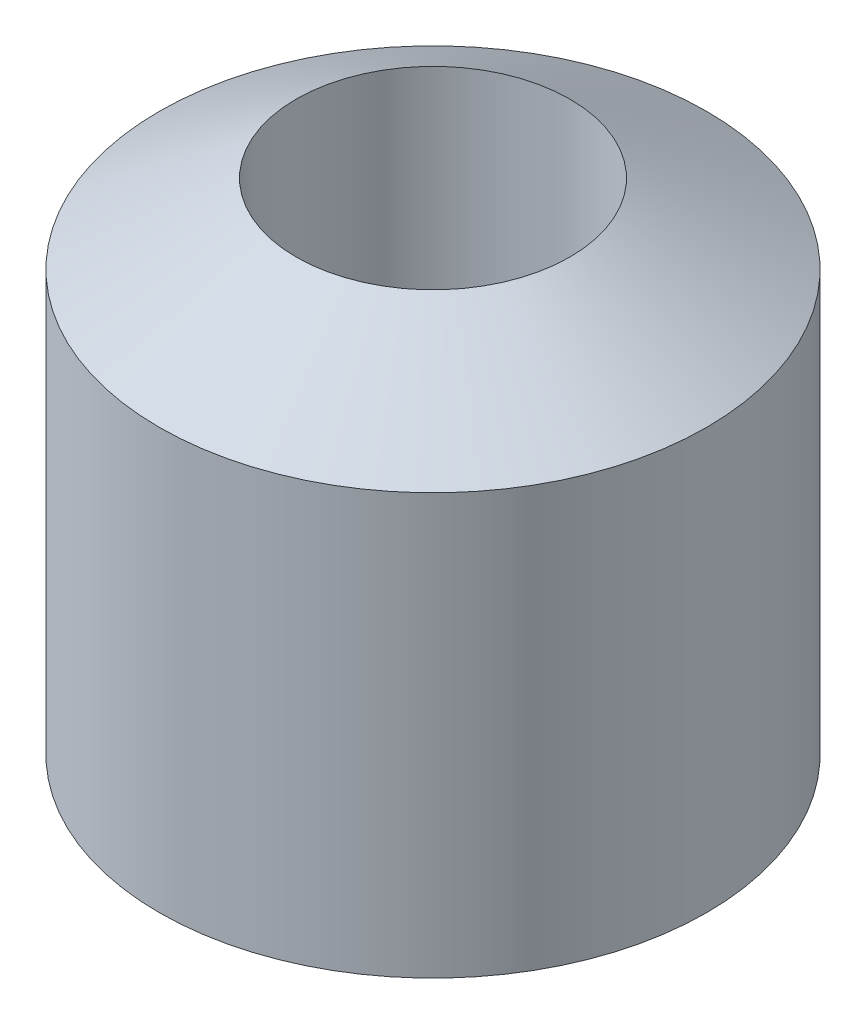
ISO-10303-21;
HEADER;
FILE_DESCRIPTION(('STEP AP214'),'2;1');
FILE_NAME('part.step','',(''),(''),'','','');
FILE_SCHEMA(('AUTOMOTIVE_DESIGN { 1 0 10303 214 1 1 1 1 }'));
ENDSEC;
DATA;
#1=APPLICATION_CONTEXT('core data for automotive mechanical design processes');
#2=APPLICATION_PROTOCOL_DEFINITION('international standard','automotive_design',2000,#1);
#3=PRODUCT_CONTEXT('',#1,'mechanical');
#4=PRODUCT('Part','Part','',(#3));
#5=PRODUCT_RELATED_PRODUCT_CATEGORY('part','',(#4));
#6=PRODUCT_DEFINITION_FORMATION('','',#4);
#7=PRODUCT_DEFINITION_CONTEXT('part definition',#1,'design');
#8=PRODUCT_DEFINITION('design','',#6,#7);
#9=PRODUCT_DEFINITION_SHAPE('','',#8);
#10=(LENGTH_UNIT() NAMED_UNIT(*) SI_UNIT(.MILLI.,.METRE.));
#11=(NAMED_UNIT(*) PLANE_ANGLE_UNIT() SI_UNIT($,.RADIAN.));
#12=(NAMED_UNIT(*) SI_UNIT($,.STERADIAN.) SOLID_ANGLE_UNIT());
#13=UNCERTAINTY_MEASURE_WITH_UNIT(LENGTH_MEASURE(1.E-05),#10,'distance_accuracy_value','');
#14=(GEOMETRIC_REPRESENTATION_CONTEXT(3) GLOBAL_UNCERTAINTY_ASSIGNED_CONTEXT((#13)) GLOBAL_UNIT_ASSIGNED_CONTEXT((#10,
#11,#12)) REPRESENTATION_CONTEXT('',''));
#15=CARTESIAN_POINT('',(0.,0.,0.));
#16=DIRECTION('',(0.,0.,1.));
#17=DIRECTION('',(1.,0.,0.));
#18=AXIS2_PLACEMENT_3D('',#15,#16,#17);
#19=CARTESIAN_POINT('',(0.,21.5,0.));
#20=DIRECTION('',(0.,-1.,0.));
#21=DIRECTION('',(0.,0.,-1.));
#22=AXIS2_PLACEMENT_3D('',#19,#20,#21);
#23=CONICAL_SURFACE('',#22,28.,1.04719755119659);
#24=CARTESIAN_POINT('',(0.,29.5829037686548,0.));
#25=DIRECTION('',(0.,1.,0.));
#26=DIRECTION('',(0.,0.,1.));
#27=AXIS2_PLACEMENT_3D('',#24,#25,#26);
#28=CIRCLE('',#27,14.);
#29=CARTESIAN_POINT('',(0.,29.5829037686548,14.));
#30=VERTEX_POINT('',#29);
#31=EDGE_CURVE('E10',#30,#30,#28,.T.);
#32=ORIENTED_EDGE('',*,*,#31,.F.);
#33=EDGE_LOOP('',(#32));
#34=FACE_BOUND('',#33,.T.);
#35=CARTESIAN_POINT('',(0.,21.5,0.));
#36=DIRECTION('',(0.,1.,0.));
#37=DIRECTION('',(0.,0.,1.));
#38=AXIS2_PLACEMENT_3D('',#35,#36,#37);
#39=CIRCLE('',#38,28.);
#40=CARTESIAN_POINT('',(0.,21.5,28.));
#41=VERTEX_POINT('',#40);
#42=EDGE_CURVE('E44',#41,#41,#39,.T.);
#43=ORIENTED_EDGE('',*,*,#42,.T.);
#44=EDGE_LOOP('',(#43));
#45=FACE_BOUND('',#44,.T.);
#46=ADVANCED_FACE('F30',(#34,#45),#23,.T.);
#47=CARTESIAN_POINT('',(0.,129.330769230769,0.));
#48=DIRECTION('',(0.,1.,0.));
#49=DIRECTION('',(0.,0.,1.));
#50=AXIS2_PLACEMENT_3D('',#47,#48,#49);
#51=CYLINDRICAL_SURFACE('',#50,14.);
#52=CARTESIAN_POINT('',(0.,-29.5829037686548,0.));
#53=DIRECTION('',(0.,1.,0.));
#54=DIRECTION('',(0.,0.,1.));
#55=AXIS2_PLACEMENT_3D('',#52,#53,#54);
#56=CIRCLE('',#55,14.);
#57=CARTESIAN_POINT('',(0.,-29.5829037686548,14.));
#58=VERTEX_POINT('',#57);
#59=EDGE_CURVE('E36',#58,#58,#56,.T.);
#60=ORIENTED_EDGE('',*,*,#59,.F.);
#61=EDGE_LOOP('',(#60));
#62=FACE_BOUND('',#61,.T.);
#63=ORIENTED_EDGE('',*,*,#31,.T.);
#64=EDGE_LOOP('',(#63));
#65=FACE_BOUND('',#64,.T.);
#66=ADVANCED_FACE('F59',(#62,#65),#51,.F.);
#67=CARTESIAN_POINT('',(0.,-29.5829037686548,0.));
#68=DIRECTION('',(0.,1.,0.));
#69=DIRECTION('',(0.,0.,1.));
#70=AXIS2_PLACEMENT_3D('',#67,#68,#69);
#71=CONICAL_SURFACE('',#70,14.,1.0471975511966);
#72=CARTESIAN_POINT('',(0.,-21.5,0.));
#73=DIRECTION('',(0.,1.,0.));
#74=DIRECTION('',(0.,0.,1.));
#75=AXIS2_PLACEMENT_3D('',#72,#73,#74);
#76=CIRCLE('',#75,28.);
#77=CARTESIAN_POINT('',(0.,-21.5,28.));
#78=VERTEX_POINT('',#77);
#79=EDGE_CURVE('E40',#78,#78,#76,.T.);
#80=ORIENTED_EDGE('',*,*,#79,.F.);
#81=EDGE_LOOP('',(#80));
#82=FACE_BOUND('',#81,.T.);
#83=ORIENTED_EDGE('',*,*,#59,.T.);
#84=EDGE_LOOP('',(#83));
#85=FACE_BOUND('',#84,.T.);
#86=ADVANCED_FACE('F54',(#82,#85),#71,.T.);
#87=CARTESIAN_POINT('',(0.,129.330769230769,0.));
#88=DIRECTION('',(0.,1.,0.));
#89=DIRECTION('',(0.,0.,1.));
#90=AXIS2_PLACEMENT_3D('',#87,#88,#89);
#91=CYLINDRICAL_SURFACE('',#90,28.);
#92=ORIENTED_EDGE('',*,*,#42,.F.);
#93=EDGE_LOOP('',(#92));
#94=FACE_BOUND('',#93,.T.);
#95=ORIENTED_EDGE('',*,*,#79,.T.);
#96=EDGE_LOOP('',(#95));
#97=FACE_BOUND('',#96,.T.);
#98=ADVANCED_FACE('F51',(#94,#97),#91,.T.);
#99=CLOSED_SHELL('',(#46,#66,#86,#98));
#100=MANIFOLD_SOLID_BREP('B2',#99);
#101=ADVANCED_BREP_SHAPE_REPRESENTATION('',(#18,#100),#14);
#102=SHAPE_DEFINITION_REPRESENTATION(#9,#101);
ENDSEC;
END-ISO-10303-21;
